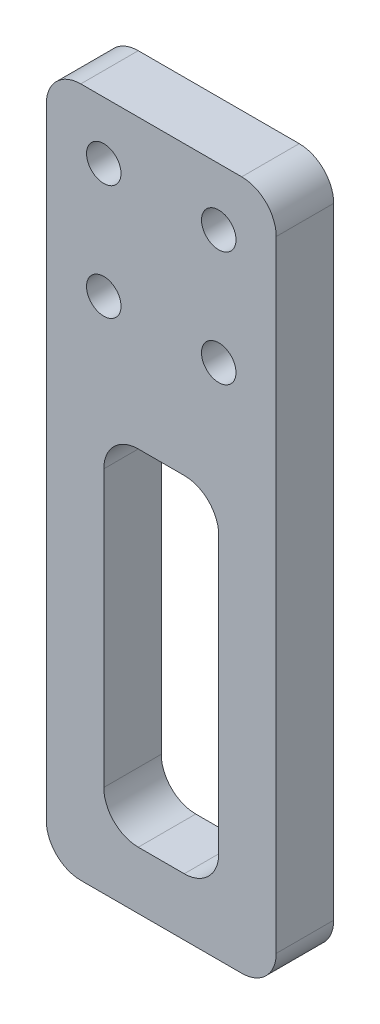
ISO-10303-21;
HEADER;
FILE_DESCRIPTION(('STEP AP214'),'2;1');
FILE_NAME('part.step','',(''),(''),'','','');
FILE_SCHEMA(('AUTOMOTIVE_DESIGN { 1 0 10303 214 1 1 1 1 }'));
ENDSEC;
DATA;
#1=APPLICATION_CONTEXT('core data for automotive mechanical design processes');
#2=APPLICATION_PROTOCOL_DEFINITION('international standard','automotive_design',2000,#1);
#3=PRODUCT_CONTEXT('',#1,'mechanical');
#4=PRODUCT('Part','Part','',(#3));
#5=PRODUCT_RELATED_PRODUCT_CATEGORY('part','',(#4));
#6=PRODUCT_DEFINITION_FORMATION('','',#4);
#7=PRODUCT_DEFINITION_CONTEXT('part definition',#1,'design');
#8=PRODUCT_DEFINITION('design','',#6,#7);
#9=PRODUCT_DEFINITION_SHAPE('','',#8);
#10=(LENGTH_UNIT() NAMED_UNIT(*) SI_UNIT(.MILLI.,.METRE.));
#11=(NAMED_UNIT(*) PLANE_ANGLE_UNIT() SI_UNIT($,.RADIAN.));
#12=(NAMED_UNIT(*) SI_UNIT($,.STERADIAN.) SOLID_ANGLE_UNIT());
#13=UNCERTAINTY_MEASURE_WITH_UNIT(LENGTH_MEASURE(1.E-05),#10,'distance_accuracy_value','');
#14=(GEOMETRIC_REPRESENTATION_CONTEXT(3) GLOBAL_UNCERTAINTY_ASSIGNED_CONTEXT((#13)) GLOBAL_UNIT_ASSIGNED_CONTEXT((#10,
#11,#12)) REPRESENTATION_CONTEXT('',''));
#15=CARTESIAN_POINT('',(0.,0.,0.));
#16=DIRECTION('',(0.,0.,1.));
#17=DIRECTION('',(1.,0.,0.));
#18=AXIS2_PLACEMENT_3D('',#15,#16,#17);
#19=CARTESIAN_POINT('',(10.,-30.,5.));
#20=DIRECTION('',(-1.,0.,0.));
#21=DIRECTION('',(0.,0.,1.));
#22=AXIS2_PLACEMENT_3D('',#19,#20,#21);
#23=PLANE('',#22);
#24=DIRECTION('',(0.,1.,0.));
#25=VECTOR('',#24,1.);
#26=CARTESIAN_POINT('',(10.,-30.,0.));
#27=LINE('',#26,#25);
#28=CARTESIAN_POINT('',(10.,-27.,0.));
#29=VERTEX_POINT('',#28);
#30=CARTESIAN_POINT('',(10.,27.,0.));
#31=VERTEX_POINT('',#30);
#32=EDGE_CURVE('E179',#29,#31,#27,.T.);
#33=ORIENTED_EDGE('',*,*,#32,.T.);
#34=DIRECTION('',(0.,0.,-1.));
#35=VECTOR('',#34,1.);
#36=CARTESIAN_POINT('',(10.,27.,5.));
#37=LINE('',#36,#35);
#38=CARTESIAN_POINT('',(10.,27.,5.));
#39=VERTEX_POINT('',#38);
#40=EDGE_CURVE('E202',#31,#39,#37,.F.);
#41=ORIENTED_EDGE('',*,*,#40,.T.);
#42=DIRECTION('',(0.,1.,0.));
#43=VECTOR('',#42,1.);
#44=CARTESIAN_POINT('',(10.,-30.,5.));
#45=LINE('',#44,#43);
#46=CARTESIAN_POINT('',(10.,-27.,5.));
#47=VERTEX_POINT('',#46);
#48=EDGE_CURVE('E177',#47,#39,#45,.T.);
#49=ORIENTED_EDGE('',*,*,#48,.F.);
#50=DIRECTION('',(0.,0.,-1.));
#51=VECTOR('',#50,1.);
#52=CARTESIAN_POINT('',(10.,-27.,5.));
#53=LINE('',#52,#51);
#54=EDGE_CURVE('E199',#47,#29,#53,.T.);
#55=ORIENTED_EDGE('',*,*,#54,.T.);
#56=EDGE_LOOP('',(#33,#41,#49,#55));
#57=FACE_BOUND('',#56,.T.);
#58=ADVANCED_FACE('F35',(#57),#23,.F.);
#59=CARTESIAN_POINT('',(-10.,30.,5.));
#60=DIRECTION('',(0.,-1.,0.));
#61=DIRECTION('',(0.,0.,-1.));
#62=AXIS2_PLACEMENT_3D('',#59,#60,#61);
#63=PLANE('',#62);
#64=DIRECTION('',(-1.,0.,0.));
#65=VECTOR('',#64,1.);
#66=CARTESIAN_POINT('',(-10.,30.,0.));
#67=LINE('',#66,#65);
#68=CARTESIAN_POINT('',(7.,30.,0.));
#69=VERTEX_POINT('',#68);
#70=CARTESIAN_POINT('',(-7.,30.,0.));
#71=VERTEX_POINT('',#70);
#72=EDGE_CURVE('E175',#69,#71,#67,.T.);
#73=ORIENTED_EDGE('',*,*,#72,.T.);
#74=DIRECTION('',(0.,0.,-1.));
#75=VECTOR('',#74,1.);
#76=CARTESIAN_POINT('',(-7.,30.,5.));
#77=LINE('',#76,#75);
#78=CARTESIAN_POINT('',(-7.,30.,5.));
#79=VERTEX_POINT('',#78);
#80=EDGE_CURVE('E154',#71,#79,#77,.F.);
#81=ORIENTED_EDGE('',*,*,#80,.T.);
#82=DIRECTION('',(-1.,0.,0.));
#83=VECTOR('',#82,1.);
#84=CARTESIAN_POINT('',(-10.,30.,5.));
#85=LINE('',#84,#83);
#86=CARTESIAN_POINT('',(7.,30.,5.));
#87=VERTEX_POINT('',#86);
#88=EDGE_CURVE('E309',#87,#79,#85,.T.);
#89=ORIENTED_EDGE('',*,*,#88,.F.);
#90=DIRECTION('',(0.,0.,-1.));
#91=VECTOR('',#90,1.);
#92=CARTESIAN_POINT('',(7.,30.,5.));
#93=LINE('',#92,#91);
#94=EDGE_CURVE('E159',#87,#69,#93,.T.);
#95=ORIENTED_EDGE('',*,*,#94,.T.);
#96=EDGE_LOOP('',(#73,#81,#89,#95));
#97=FACE_BOUND('',#96,.T.);
#98=ADVANCED_FACE('F325',(#97),#63,.F.);
#99=CARTESIAN_POINT('',(-10.,-30.,5.));
#100=DIRECTION('',(1.,0.,0.));
#101=DIRECTION('',(0.,0.,-1.));
#102=AXIS2_PLACEMENT_3D('',#99,#100,#101);
#103=PLANE('',#102);
#104=DIRECTION('',(0.,-1.,0.));
#105=VECTOR('',#104,1.);
#106=CARTESIAN_POINT('',(-10.,-30.,5.));
#107=LINE('',#106,#105);
#108=CARTESIAN_POINT('',(-10.,27.,5.));
#109=VERTEX_POINT('',#108);
#110=CARTESIAN_POINT('',(-10.,-27.,5.));
#111=VERTEX_POINT('',#110);
#112=EDGE_CURVE('E168',#109,#111,#107,.T.);
#113=ORIENTED_EDGE('',*,*,#112,.F.);
#114=DIRECTION('',(0.,0.,-1.));
#115=VECTOR('',#114,1.);
#116=CARTESIAN_POINT('',(-10.,27.,5.));
#117=LINE('',#116,#115);
#118=CARTESIAN_POINT('',(-10.,27.,0.));
#119=VERTEX_POINT('',#118);
#120=EDGE_CURVE('E153',#109,#119,#117,.T.);
#121=ORIENTED_EDGE('',*,*,#120,.T.);
#122=DIRECTION('',(0.,-1.,0.));
#123=VECTOR('',#122,1.);
#124=CARTESIAN_POINT('',(-10.,-30.,0.));
#125=LINE('',#124,#123);
#126=CARTESIAN_POINT('',(-10.,-27.,0.));
#127=VERTEX_POINT('',#126);
#128=EDGE_CURVE('E166',#119,#127,#125,.T.);
#129=ORIENTED_EDGE('',*,*,#128,.T.);
#130=DIRECTION('',(0.,0.,-1.));
#131=VECTOR('',#130,1.);
#132=CARTESIAN_POINT('',(-10.,-27.,5.));
#133=LINE('',#132,#131);
#134=EDGE_CURVE('E170',#127,#111,#133,.F.);
#135=ORIENTED_EDGE('',*,*,#134,.T.);
#136=EDGE_LOOP('',(#113,#121,#129,#135));
#137=FACE_BOUND('',#136,.T.);
#138=ADVANCED_FACE('F165',(#137),#103,.F.);
#139=CARTESIAN_POINT('',(-10.,-30.,5.));
#140=DIRECTION('',(0.,1.,0.));
#141=DIRECTION('',(0.,0.,1.));
#142=AXIS2_PLACEMENT_3D('',#139,#140,#141);
#143=PLANE('',#142);
#144=DIRECTION('',(1.,0.,0.));
#145=VECTOR('',#144,1.);
#146=CARTESIAN_POINT('',(-10.,-30.,0.));
#147=LINE('',#146,#145);
#148=CARTESIAN_POINT('',(-7.,-30.,0.));
#149=VERTEX_POINT('',#148);
#150=CARTESIAN_POINT('',(7.,-30.,0.));
#151=VERTEX_POINT('',#150);
#152=EDGE_CURVE('E174',#149,#151,#147,.T.);
#153=ORIENTED_EDGE('',*,*,#152,.T.);
#154=DIRECTION('',(0.,0.,-1.));
#155=VECTOR('',#154,1.);
#156=CARTESIAN_POINT('',(7.,-30.,5.));
#157=LINE('',#156,#155);
#158=CARTESIAN_POINT('',(7.,-30.,5.));
#159=VERTEX_POINT('',#158);
#160=EDGE_CURVE('E50',#151,#159,#157,.F.);
#161=ORIENTED_EDGE('',*,*,#160,.T.);
#162=DIRECTION('',(1.,0.,0.));
#163=VECTOR('',#162,1.);
#164=CARTESIAN_POINT('',(-10.,-30.,5.));
#165=LINE('',#164,#163);
#166=CARTESIAN_POINT('',(-7.,-30.,5.));
#167=VERTEX_POINT('',#166);
#168=EDGE_CURVE('E183',#167,#159,#165,.T.);
#169=ORIENTED_EDGE('',*,*,#168,.F.);
#170=DIRECTION('',(0.,0.,-1.));
#171=VECTOR('',#170,1.);
#172=CARTESIAN_POINT('',(-7.,-30.,5.));
#173=LINE('',#172,#171);
#174=EDGE_CURVE('E204',#167,#149,#173,.T.);
#175=ORIENTED_EDGE('',*,*,#174,.T.);
#176=EDGE_LOOP('',(#153,#161,#169,#175));
#177=FACE_BOUND('',#176,.T.);
#178=ADVANCED_FACE('F332',(#177),#143,.F.);
#179=CARTESIAN_POINT('',(0.,0.,5.));
#180=DIRECTION('',(0.,0.,-1.));
#181=DIRECTION('',(-1.,0.,0.));
#182=AXIS2_PLACEMENT_3D('',#179,#180,#181);
#183=PLANE('',#182);
#184=DIRECTION('',(-1.,0.,0.));
#185=VECTOR('',#184,1.);
#186=CARTESIAN_POINT('',(-5.,5.,5.));
#187=LINE('',#186,#185);
#188=CARTESIAN_POINT('',(2.,5.,5.));
#189=VERTEX_POINT('',#188);
#190=CARTESIAN_POINT('',(-2.,5.,5.));
#191=VERTEX_POINT('',#190);
#192=EDGE_CURVE('E245',#189,#191,#187,.T.);
#193=ORIENTED_EDGE('',*,*,#192,.F.);
#194=CARTESIAN_POINT('',(2.,2.,5.));
#195=DIRECTION('',(0.,0.,-1.));
#196=DIRECTION('',(-1.,0.,0.));
#197=AXIS2_PLACEMENT_3D('',#194,#195,#196);
#198=CIRCLE('',#197,3.);
#199=CARTESIAN_POINT('',(5.,2.,5.));
#200=VERTEX_POINT('',#199);
#201=EDGE_CURVE('E236',#189,#200,#198,.T.);
#202=ORIENTED_EDGE('',*,*,#201,.T.);
#203=DIRECTION('',(0.,1.,0.));
#204=VECTOR('',#203,1.);
#205=CARTESIAN_POINT('',(5.,-25.,5.));
#206=LINE('',#205,#204);
#207=CARTESIAN_POINT('',(5.,-22.,5.));
#208=VERTEX_POINT('',#207);
#209=EDGE_CURVE('E256',#208,#200,#206,.T.);
#210=ORIENTED_EDGE('',*,*,#209,.F.);
#211=CARTESIAN_POINT('',(2.,-22.,5.));
#212=DIRECTION('',(0.,0.,-1.));
#213=DIRECTION('',(-1.,0.,0.));
#214=AXIS2_PLACEMENT_3D('',#211,#212,#213);
#215=CIRCLE('',#214,3.);
#216=CARTESIAN_POINT('',(2.,-25.,5.));
#217=VERTEX_POINT('',#216);
#218=EDGE_CURVE('E228',#208,#217,#215,.T.);
#219=ORIENTED_EDGE('',*,*,#218,.T.);
#220=DIRECTION('',(1.,0.,0.));
#221=VECTOR('',#220,1.);
#222=CARTESIAN_POINT('',(-5.,-25.,5.));
#223=LINE('',#222,#221);
#224=CARTESIAN_POINT('',(-2.,-25.,5.));
#225=VERTEX_POINT('',#224);
#226=EDGE_CURVE('E281',#225,#217,#223,.T.);
#227=ORIENTED_EDGE('',*,*,#226,.F.);
#228=CARTESIAN_POINT('',(-2.,-22.,5.));
#229=DIRECTION('',(0.,0.,-1.));
#230=DIRECTION('',(-1.,0.,0.));
#231=AXIS2_PLACEMENT_3D('',#228,#229,#230);
#232=CIRCLE('',#231,3.);
#233=CARTESIAN_POINT('',(-5.,-22.,5.));
#234=VERTEX_POINT('',#233);
#235=EDGE_CURVE('E232',#225,#234,#232,.T.);
#236=ORIENTED_EDGE('',*,*,#235,.T.);
#237=DIRECTION('',(0.,-1.,0.));
#238=VECTOR('',#237,1.);
#239=CARTESIAN_POINT('',(-5.,-25.,5.));
#240=LINE('',#239,#238);
#241=CARTESIAN_POINT('',(-5.,2.,5.));
#242=VERTEX_POINT('',#241);
#243=EDGE_CURVE('E247',#242,#234,#240,.T.);
#244=ORIENTED_EDGE('',*,*,#243,.F.);
#245=CARTESIAN_POINT('',(-2.,2.,5.));
#246=DIRECTION('',(0.,0.,-1.));
#247=DIRECTION('',(-1.,0.,0.));
#248=AXIS2_PLACEMENT_3D('',#245,#246,#247);
#249=CIRCLE('',#248,3.);
#250=EDGE_CURVE('E43',#242,#191,#249,.T.);
#251=ORIENTED_EDGE('',*,*,#250,.T.);
#252=EDGE_LOOP('',(#193,#202,#210,#219,#227,#236,#244,#251));
#253=FACE_BOUND('',#252,.T.);
#254=CARTESIAN_POINT('',(5.,25.,5.));
#255=DIRECTION('',(0.,0.,1.));
#256=DIRECTION('',(-1.,0.,0.));
#257=AXIS2_PLACEMENT_3D('',#254,#255,#256);
#258=CIRCLE('',#257,1.5);
#259=CARTESIAN_POINT('',(3.5,25.,5.));
#260=VERTEX_POINT('',#259);
#261=EDGE_CURVE('E272',#260,#260,#258,.T.);
#262=ORIENTED_EDGE('',*,*,#261,.F.);
#263=EDGE_LOOP('',(#262));
#264=FACE_BOUND('',#263,.T.);
#265=CARTESIAN_POINT('',(5.,15.,5.));
#266=DIRECTION('',(0.,0.,1.));
#267=DIRECTION('',(-1.,0.,0.));
#268=AXIS2_PLACEMENT_3D('',#265,#266,#267);
#269=CIRCLE('',#268,1.5);
#270=CARTESIAN_POINT('',(3.5,15.,5.));
#271=VERTEX_POINT('',#270);
#272=EDGE_CURVE('E294',#271,#271,#269,.T.);
#273=ORIENTED_EDGE('',*,*,#272,.F.);
#274=EDGE_LOOP('',(#273));
#275=FACE_BOUND('',#274,.T.);
#276=CARTESIAN_POINT('',(-5.,15.,5.));
#277=DIRECTION('',(0.,0.,1.));
#278=DIRECTION('',(1.,0.,0.));
#279=AXIS2_PLACEMENT_3D('',#276,#277,#278);
#280=CIRCLE('',#279,1.5);
#281=CARTESIAN_POINT('',(-3.5,15.,5.));
#282=VERTEX_POINT('',#281);
#283=EDGE_CURVE('E288',#282,#282,#280,.T.);
#284=ORIENTED_EDGE('',*,*,#283,.F.);
#285=EDGE_LOOP('',(#284));
#286=FACE_BOUND('',#285,.T.);
#287=CARTESIAN_POINT('',(-5.,25.,5.));
#288=DIRECTION('',(0.,0.,1.));
#289=DIRECTION('',(1.,0.,0.));
#290=AXIS2_PLACEMENT_3D('',#287,#288,#289);
#291=CIRCLE('',#290,1.5);
#292=CARTESIAN_POINT('',(-3.5,25.,5.));
#293=VERTEX_POINT('',#292);
#294=EDGE_CURVE('E287',#293,#293,#291,.T.);
#295=ORIENTED_EDGE('',*,*,#294,.F.);
#296=EDGE_LOOP('',(#295));
#297=FACE_BOUND('',#296,.T.);
#298=ORIENTED_EDGE('',*,*,#88,.T.);
#299=CARTESIAN_POINT('',(-7.,27.,5.));
#300=DIRECTION('',(0.,0.,-1.));
#301=DIRECTION('',(-1.,0.,0.));
#302=AXIS2_PLACEMENT_3D('',#299,#300,#301);
#303=CIRCLE('',#302,3.);
#304=EDGE_CURVE('E197',#79,#109,#303,.F.);
#305=ORIENTED_EDGE('',*,*,#304,.T.);
#306=ORIENTED_EDGE('',*,*,#112,.T.);
#307=CARTESIAN_POINT('',(-7.,-27.,5.));
#308=DIRECTION('',(0.,0.,-1.));
#309=DIRECTION('',(-1.,0.,0.));
#310=AXIS2_PLACEMENT_3D('',#307,#308,#309);
#311=CIRCLE('',#310,3.);
#312=EDGE_CURVE('E57',#111,#167,#311,.F.);
#313=ORIENTED_EDGE('',*,*,#312,.T.);
#314=ORIENTED_EDGE('',*,*,#168,.T.);
#315=CARTESIAN_POINT('',(7.,-27.,5.));
#316=DIRECTION('',(0.,0.,-1.));
#317=DIRECTION('',(-1.,0.,0.));
#318=AXIS2_PLACEMENT_3D('',#315,#316,#317);
#319=CIRCLE('',#318,3.);
#320=EDGE_CURVE('E193',#159,#47,#319,.F.);
#321=ORIENTED_EDGE('',*,*,#320,.T.);
#322=ORIENTED_EDGE('',*,*,#48,.T.);
#323=CARTESIAN_POINT('',(7.,27.,5.));
#324=DIRECTION('',(0.,0.,-1.));
#325=DIRECTION('',(-1.,0.,0.));
#326=AXIS2_PLACEMENT_3D('',#323,#324,#325);
#327=CIRCLE('',#326,3.);
#328=EDGE_CURVE('E195',#39,#87,#327,.F.);
#329=ORIENTED_EDGE('',*,*,#328,.T.);
#330=EDGE_LOOP('',(#298,#305,#306,#313,#314,#321,#322,#329));
#331=FACE_BOUND('',#330,.T.);
#332=ADVANCED_FACE('F243',(#253,#264,#275,#286,#297,#331),#183,.F.);
#333=CARTESIAN_POINT('',(0.,0.,0.));
#334=DIRECTION('',(0.,0.,-1.));
#335=DIRECTION('',(-1.,0.,0.));
#336=AXIS2_PLACEMENT_3D('',#333,#334,#335);
#337=PLANE('',#336);
#338=DIRECTION('',(1.,0.,0.));
#339=VECTOR('',#338,1.);
#340=CARTESIAN_POINT('',(-5.,-25.,0.));
#341=LINE('',#340,#339);
#342=CARTESIAN_POINT('',(-2.,-25.,0.));
#343=VERTEX_POINT('',#342);
#344=CARTESIAN_POINT('',(2.,-25.,0.));
#345=VERTEX_POINT('',#344);
#346=EDGE_CURVE('E270',#343,#345,#341,.T.);
#347=ORIENTED_EDGE('',*,*,#346,.T.);
#348=CARTESIAN_POINT('',(2.,-22.,0.));
#349=DIRECTION('',(0.,0.,-1.));
#350=DIRECTION('',(-1.,0.,0.));
#351=AXIS2_PLACEMENT_3D('',#348,#349,#350);
#352=CIRCLE('',#351,3.);
#353=CARTESIAN_POINT('',(5.,-22.,0.));
#354=VERTEX_POINT('',#353);
#355=EDGE_CURVE('E230',#345,#354,#352,.F.);
#356=ORIENTED_EDGE('',*,*,#355,.T.);
#357=DIRECTION('',(0.,1.,0.));
#358=VECTOR('',#357,1.);
#359=CARTESIAN_POINT('',(5.,-25.,0.));
#360=LINE('',#359,#358);
#361=CARTESIAN_POINT('',(5.,2.,0.));
#362=VERTEX_POINT('',#361);
#363=EDGE_CURVE('E274',#354,#362,#360,.T.);
#364=ORIENTED_EDGE('',*,*,#363,.T.);
#365=CARTESIAN_POINT('',(2.,2.,0.));
#366=DIRECTION('',(0.,0.,-1.));
#367=DIRECTION('',(-1.,0.,0.));
#368=AXIS2_PLACEMENT_3D('',#365,#366,#367);
#369=CIRCLE('',#368,3.);
#370=CARTESIAN_POINT('',(2.,5.,0.));
#371=VERTEX_POINT('',#370);
#372=EDGE_CURVE('E238',#362,#371,#369,.F.);
#373=ORIENTED_EDGE('',*,*,#372,.T.);
#374=DIRECTION('',(-1.,0.,0.));
#375=VECTOR('',#374,1.);
#376=CARTESIAN_POINT('',(-5.,5.,0.));
#377=LINE('',#376,#375);
#378=CARTESIAN_POINT('',(-2.,5.,0.));
#379=VERTEX_POINT('',#378);
#380=EDGE_CURVE('E266',#371,#379,#377,.T.);
#381=ORIENTED_EDGE('',*,*,#380,.T.);
#382=CARTESIAN_POINT('',(-2.,2.,0.));
#383=DIRECTION('',(0.,0.,-1.));
#384=DIRECTION('',(-1.,0.,0.));
#385=AXIS2_PLACEMENT_3D('',#382,#383,#384);
#386=CIRCLE('',#385,3.);
#387=CARTESIAN_POINT('',(-5.,2.,0.));
#388=VERTEX_POINT('',#387);
#389=EDGE_CURVE('E11',#379,#388,#386,.F.);
#390=ORIENTED_EDGE('',*,*,#389,.T.);
#391=DIRECTION('',(0.,-1.,0.));
#392=VECTOR('',#391,1.);
#393=CARTESIAN_POINT('',(-5.,-25.,0.));
#394=LINE('',#393,#392);
#395=CARTESIAN_POINT('',(-5.,-22.,0.));
#396=VERTEX_POINT('',#395);
#397=EDGE_CURVE('E264',#388,#396,#394,.T.);
#398=ORIENTED_EDGE('',*,*,#397,.T.);
#399=CARTESIAN_POINT('',(-2.,-22.,0.));
#400=DIRECTION('',(0.,0.,-1.));
#401=DIRECTION('',(-1.,0.,0.));
#402=AXIS2_PLACEMENT_3D('',#399,#400,#401);
#403=CIRCLE('',#402,3.);
#404=EDGE_CURVE('E234',#396,#343,#403,.F.);
#405=ORIENTED_EDGE('',*,*,#404,.T.);
#406=EDGE_LOOP('',(#347,#356,#364,#373,#381,#390,#398,#405));
#407=FACE_BOUND('',#406,.T.);
#408=CARTESIAN_POINT('',(5.,25.,0.));
#409=DIRECTION('',(0.,0.,1.));
#410=DIRECTION('',(-1.,0.,0.));
#411=AXIS2_PLACEMENT_3D('',#408,#409,#410);
#412=CIRCLE('',#411,1.5);
#413=CARTESIAN_POINT('',(3.5,25.,0.));
#414=VERTEX_POINT('',#413);
#415=EDGE_CURVE('E297',#414,#414,#412,.T.);
#416=ORIENTED_EDGE('',*,*,#415,.T.);
#417=EDGE_LOOP('',(#416));
#418=FACE_BOUND('',#417,.T.);
#419=CARTESIAN_POINT('',(5.,15.,0.));
#420=DIRECTION('',(0.,0.,1.));
#421=DIRECTION('',(-1.,0.,0.));
#422=AXIS2_PLACEMENT_3D('',#419,#420,#421);
#423=CIRCLE('',#422,1.5);
#424=CARTESIAN_POINT('',(3.5,15.,0.));
#425=VERTEX_POINT('',#424);
#426=EDGE_CURVE('E291',#425,#425,#423,.T.);
#427=ORIENTED_EDGE('',*,*,#426,.T.);
#428=EDGE_LOOP('',(#427));
#429=FACE_BOUND('',#428,.T.);
#430=CARTESIAN_POINT('',(-5.,15.,0.));
#431=DIRECTION('',(0.,0.,1.));
#432=DIRECTION('',(1.,0.,0.));
#433=AXIS2_PLACEMENT_3D('',#430,#431,#432);
#434=CIRCLE('',#433,1.5);
#435=CARTESIAN_POINT('',(-3.5,15.,0.));
#436=VERTEX_POINT('',#435);
#437=EDGE_CURVE('E284',#436,#436,#434,.T.);
#438=ORIENTED_EDGE('',*,*,#437,.T.);
#439=EDGE_LOOP('',(#438));
#440=FACE_BOUND('',#439,.T.);
#441=CARTESIAN_POINT('',(-5.,25.,0.));
#442=DIRECTION('',(0.,0.,1.));
#443=DIRECTION('',(1.,0.,0.));
#444=AXIS2_PLACEMENT_3D('',#441,#442,#443);
#445=CIRCLE('',#444,1.5);
#446=CARTESIAN_POINT('',(-3.5,25.,0.));
#447=VERTEX_POINT('',#446);
#448=EDGE_CURVE('E302',#447,#447,#445,.T.);
#449=ORIENTED_EDGE('',*,*,#448,.T.);
#450=EDGE_LOOP('',(#449));
#451=FACE_BOUND('',#450,.T.);
#452=ORIENTED_EDGE('',*,*,#128,.F.);
#453=CARTESIAN_POINT('',(-7.,27.,0.));
#454=DIRECTION('',(0.,0.,-1.));
#455=DIRECTION('',(-1.,0.,0.));
#456=AXIS2_PLACEMENT_3D('',#453,#454,#455);
#457=CIRCLE('',#456,3.);
#458=EDGE_CURVE('E149',#119,#71,#457,.T.);
#459=ORIENTED_EDGE('',*,*,#458,.T.);
#460=ORIENTED_EDGE('',*,*,#72,.F.);
#461=CARTESIAN_POINT('',(7.,27.,0.));
#462=DIRECTION('',(0.,0.,-1.));
#463=DIRECTION('',(-1.,0.,0.));
#464=AXIS2_PLACEMENT_3D('',#461,#462,#463);
#465=CIRCLE('',#464,3.);
#466=EDGE_CURVE('E160',#69,#31,#465,.T.);
#467=ORIENTED_EDGE('',*,*,#466,.T.);
#468=ORIENTED_EDGE('',*,*,#32,.F.);
#469=CARTESIAN_POINT('',(7.,-27.,0.));
#470=DIRECTION('',(0.,0.,-1.));
#471=DIRECTION('',(-1.,0.,0.));
#472=AXIS2_PLACEMENT_3D('',#469,#470,#471);
#473=CIRCLE('',#472,3.);
#474=EDGE_CURVE('E186',#29,#151,#473,.T.);
#475=ORIENTED_EDGE('',*,*,#474,.T.);
#476=ORIENTED_EDGE('',*,*,#152,.F.);
#477=CARTESIAN_POINT('',(-7.,-27.,0.));
#478=DIRECTION('',(0.,0.,-1.));
#479=DIRECTION('',(-1.,0.,0.));
#480=AXIS2_PLACEMENT_3D('',#477,#478,#479);
#481=CIRCLE('',#480,3.);
#482=EDGE_CURVE('E169',#149,#127,#481,.T.);
#483=ORIENTED_EDGE('',*,*,#482,.T.);
#484=EDGE_LOOP('',(#452,#459,#460,#467,#468,#475,#476,#483));
#485=FACE_BOUND('',#484,.T.);
#486=ADVANCED_FACE('F172',(#407,#418,#429,#440,#451,#485),#337,.T.);
#487=CARTESIAN_POINT('',(-5.,25.,0.));
#488=DIRECTION('',(0.,0.,1.));
#489=DIRECTION('',(1.,0.,0.));
#490=AXIS2_PLACEMENT_3D('',#487,#488,#489);
#491=CYLINDRICAL_SURFACE('',#490,1.5);
#492=ORIENTED_EDGE('',*,*,#448,.F.);
#493=EDGE_LOOP('',(#492));
#494=FACE_BOUND('',#493,.T.);
#495=ORIENTED_EDGE('',*,*,#294,.T.);
#496=EDGE_LOOP('',(#495));
#497=FACE_BOUND('',#496,.T.);
#498=ADVANCED_FACE('F393',(#494,#497),#491,.F.);
#499=CARTESIAN_POINT('',(-5.,15.,0.));
#500=DIRECTION('',(0.,0.,1.));
#501=DIRECTION('',(1.,0.,0.));
#502=AXIS2_PLACEMENT_3D('',#499,#500,#501);
#503=CYLINDRICAL_SURFACE('',#502,1.5);
#504=ORIENTED_EDGE('',*,*,#437,.F.);
#505=EDGE_LOOP('',(#504));
#506=FACE_BOUND('',#505,.T.);
#507=ORIENTED_EDGE('',*,*,#283,.T.);
#508=EDGE_LOOP('',(#507));
#509=FACE_BOUND('',#508,.T.);
#510=ADVANCED_FACE('F389',(#506,#509),#503,.F.);
#511=CARTESIAN_POINT('',(5.,15.,0.));
#512=DIRECTION('',(0.,0.,1.));
#513=DIRECTION('',(1.,0.,0.));
#514=AXIS2_PLACEMENT_3D('',#511,#512,#513);
#515=CYLINDRICAL_SURFACE('',#514,1.5);
#516=ORIENTED_EDGE('',*,*,#426,.F.);
#517=EDGE_LOOP('',(#516));
#518=FACE_BOUND('',#517,.T.);
#519=ORIENTED_EDGE('',*,*,#272,.T.);
#520=EDGE_LOOP('',(#519));
#521=FACE_BOUND('',#520,.T.);
#522=ADVANCED_FACE('F392',(#518,#521),#515,.F.);
#523=CARTESIAN_POINT('',(5.,25.,0.));
#524=DIRECTION('',(0.,0.,1.));
#525=DIRECTION('',(1.,0.,0.));
#526=AXIS2_PLACEMENT_3D('',#523,#524,#525);
#527=CYLINDRICAL_SURFACE('',#526,1.5);
#528=ORIENTED_EDGE('',*,*,#415,.F.);
#529=EDGE_LOOP('',(#528));
#530=FACE_BOUND('',#529,.T.);
#531=ORIENTED_EDGE('',*,*,#261,.T.);
#532=EDGE_LOOP('',(#531));
#533=FACE_BOUND('',#532,.T.);
#534=ADVANCED_FACE('F384',(#530,#533),#527,.F.);
#535=CARTESIAN_POINT('',(5.,-25.,0.));
#536=DIRECTION('',(1.,0.,0.));
#537=DIRECTION('',(0.,0.,-1.));
#538=AXIS2_PLACEMENT_3D('',#535,#536,#537);
#539=PLANE('',#538);
#540=ORIENTED_EDGE('',*,*,#363,.F.);
#541=DIRECTION('',(0.,0.,1.));
#542=VECTOR('',#541,1.);
#543=CARTESIAN_POINT('',(5.,-22.,5.));
#544=LINE('',#543,#542);
#545=EDGE_CURVE('E210',#354,#208,#544,.T.);
#546=ORIENTED_EDGE('',*,*,#545,.T.);
#547=ORIENTED_EDGE('',*,*,#209,.T.);
#548=DIRECTION('',(0.,0.,1.));
#549=VECTOR('',#548,1.);
#550=CARTESIAN_POINT('',(5.,2.,0.));
#551=LINE('',#550,#549);
#552=EDGE_CURVE('E208',#200,#362,#551,.F.);
#553=ORIENTED_EDGE('',*,*,#552,.T.);
#554=EDGE_LOOP('',(#540,#546,#547,#553));
#555=FACE_BOUND('',#554,.T.);
#556=ADVANCED_FACE('F369',(#555),#539,.F.);
#557=CARTESIAN_POINT('',(-5.,-25.,0.));
#558=DIRECTION('',(0.,-1.,0.));
#559=DIRECTION('',(0.,0.,-1.));
#560=AXIS2_PLACEMENT_3D('',#557,#558,#559);
#561=PLANE('',#560);
#562=ORIENTED_EDGE('',*,*,#226,.T.);
#563=DIRECTION('',(0.,0.,1.));
#564=VECTOR('',#563,1.);
#565=CARTESIAN_POINT('',(2.,-25.,0.));
#566=LINE('',#565,#564);
#567=EDGE_CURVE('E216',#217,#345,#566,.F.);
#568=ORIENTED_EDGE('',*,*,#567,.T.);
#569=ORIENTED_EDGE('',*,*,#346,.F.);
#570=DIRECTION('',(0.,0.,1.));
#571=VECTOR('',#570,1.);
#572=CARTESIAN_POINT('',(-2.,-25.,5.));
#573=LINE('',#572,#571);
#574=EDGE_CURVE('E213',#343,#225,#573,.T.);
#575=ORIENTED_EDGE('',*,*,#574,.T.);
#576=EDGE_LOOP('',(#562,#568,#569,#575));
#577=FACE_BOUND('',#576,.T.);
#578=ADVANCED_FACE('F374',(#577),#561,.F.);
#579=CARTESIAN_POINT('',(-5.,-25.,0.));
#580=DIRECTION('',(-1.,0.,0.));
#581=DIRECTION('',(0.,0.,1.));
#582=AXIS2_PLACEMENT_3D('',#579,#580,#581);
#583=PLANE('',#582);
#584=ORIENTED_EDGE('',*,*,#243,.T.);
#585=DIRECTION('',(0.,0.,1.));
#586=VECTOR('',#585,1.);
#587=CARTESIAN_POINT('',(-5.,-22.,0.));
#588=LINE('',#587,#586);
#589=EDGE_CURVE('E221',#234,#396,#588,.F.);
#590=ORIENTED_EDGE('',*,*,#589,.T.);
#591=ORIENTED_EDGE('',*,*,#397,.F.);
#592=DIRECTION('',(0.,0.,1.));
#593=VECTOR('',#592,1.);
#594=CARTESIAN_POINT('',(-5.,2.,5.));
#595=LINE('',#594,#593);
#596=EDGE_CURVE('E218',#388,#242,#595,.T.);
#597=ORIENTED_EDGE('',*,*,#596,.T.);
#598=EDGE_LOOP('',(#584,#590,#591,#597));
#599=FACE_BOUND('',#598,.T.);
#600=ADVANCED_FACE('F268',(#599),#583,.F.);
#601=CARTESIAN_POINT('',(-5.,5.,0.));
#602=DIRECTION('',(0.,1.,0.));
#603=DIRECTION('',(0.,0.,1.));
#604=AXIS2_PLACEMENT_3D('',#601,#602,#603);
#605=PLANE('',#604);
#606=ORIENTED_EDGE('',*,*,#380,.F.);
#607=DIRECTION('',(0.,0.,1.));
#608=VECTOR('',#607,1.);
#609=CARTESIAN_POINT('',(2.,5.,5.));
#610=LINE('',#609,#608);
#611=EDGE_CURVE('E225',#371,#189,#610,.T.);
#612=ORIENTED_EDGE('',*,*,#611,.T.);
#613=ORIENTED_EDGE('',*,*,#192,.T.);
#614=DIRECTION('',(0.,0.,1.));
#615=VECTOR('',#614,1.);
#616=CARTESIAN_POINT('',(-2.,5.,0.));
#617=LINE('',#616,#615);
#618=EDGE_CURVE('E223',#191,#379,#617,.F.);
#619=ORIENTED_EDGE('',*,*,#618,.T.);
#620=EDGE_LOOP('',(#606,#612,#613,#619));
#621=FACE_BOUND('',#620,.T.);
#622=ADVANCED_FACE('F253',(#621),#605,.F.);
#623=CARTESIAN_POINT('',(-7.,27.,5.));
#624=DIRECTION('',(0.,0.,-1.));
#625=DIRECTION('',(-1.,0.,0.));
#626=AXIS2_PLACEMENT_3D('',#623,#624,#625);
#627=CYLINDRICAL_SURFACE('',#626,3.);
#628=ORIENTED_EDGE('',*,*,#304,.F.);
#629=ORIENTED_EDGE('',*,*,#80,.F.);
#630=ORIENTED_EDGE('',*,*,#458,.F.);
#631=ORIENTED_EDGE('',*,*,#120,.F.);
#632=EDGE_LOOP('',(#628,#629,#630,#631));
#633=FACE_BOUND('',#632,.T.);
#634=ADVANCED_FACE('F152',(#633),#627,.T.);
#635=CARTESIAN_POINT('',(7.,27.,5.));
#636=DIRECTION('',(0.,0.,-1.));
#637=DIRECTION('',(-1.,0.,0.));
#638=AXIS2_PLACEMENT_3D('',#635,#636,#637);
#639=CYLINDRICAL_SURFACE('',#638,3.);
#640=ORIENTED_EDGE('',*,*,#328,.F.);
#641=ORIENTED_EDGE('',*,*,#40,.F.);
#642=ORIENTED_EDGE('',*,*,#466,.F.);
#643=ORIENTED_EDGE('',*,*,#94,.F.);
#644=EDGE_LOOP('',(#640,#641,#642,#643));
#645=FACE_BOUND('',#644,.T.);
#646=ADVANCED_FACE('F321',(#645),#639,.T.);
#647=CARTESIAN_POINT('',(7.,-27.,5.));
#648=DIRECTION('',(0.,0.,-1.));
#649=DIRECTION('',(-1.,0.,0.));
#650=AXIS2_PLACEMENT_3D('',#647,#648,#649);
#651=CYLINDRICAL_SURFACE('',#650,3.);
#652=ORIENTED_EDGE('',*,*,#320,.F.);
#653=ORIENTED_EDGE('',*,*,#160,.F.);
#654=ORIENTED_EDGE('',*,*,#474,.F.);
#655=ORIENTED_EDGE('',*,*,#54,.F.);
#656=EDGE_LOOP('',(#652,#653,#654,#655));
#657=FACE_BOUND('',#656,.T.);
#658=ADVANCED_FACE('F341',(#657),#651,.T.);
#659=CARTESIAN_POINT('',(-7.,-27.,5.));
#660=DIRECTION('',(0.,0.,-1.));
#661=DIRECTION('',(-1.,0.,0.));
#662=AXIS2_PLACEMENT_3D('',#659,#660,#661);
#663=CYLINDRICAL_SURFACE('',#662,3.);
#664=ORIENTED_EDGE('',*,*,#312,.F.);
#665=ORIENTED_EDGE('',*,*,#134,.F.);
#666=ORIENTED_EDGE('',*,*,#482,.F.);
#667=ORIENTED_EDGE('',*,*,#174,.F.);
#668=EDGE_LOOP('',(#664,#665,#666,#667));
#669=FACE_BOUND('',#668,.T.);
#670=ADVANCED_FACE('F344',(#669),#663,.T.);
#671=CARTESIAN_POINT('',(2.,-22.,0.));
#672=DIRECTION('',(0.,0.,-1.));
#673=DIRECTION('',(-1.,0.,0.));
#674=AXIS2_PLACEMENT_3D('',#671,#672,#673);
#675=CYLINDRICAL_SURFACE('',#674,3.);
#676=ORIENTED_EDGE('',*,*,#355,.F.);
#677=ORIENTED_EDGE('',*,*,#567,.F.);
#678=ORIENTED_EDGE('',*,*,#218,.F.);
#679=ORIENTED_EDGE('',*,*,#545,.F.);
#680=EDGE_LOOP('',(#676,#677,#678,#679));
#681=FACE_BOUND('',#680,.T.);
#682=ADVANCED_FACE('F348',(#681),#675,.F.);
#683=CARTESIAN_POINT('',(-2.,-22.,0.));
#684=DIRECTION('',(0.,0.,-1.));
#685=DIRECTION('',(-1.,0.,0.));
#686=AXIS2_PLACEMENT_3D('',#683,#684,#685);
#687=CYLINDRICAL_SURFACE('',#686,3.);
#688=ORIENTED_EDGE('',*,*,#404,.F.);
#689=ORIENTED_EDGE('',*,*,#589,.F.);
#690=ORIENTED_EDGE('',*,*,#235,.F.);
#691=ORIENTED_EDGE('',*,*,#574,.F.);
#692=EDGE_LOOP('',(#688,#689,#690,#691));
#693=FACE_BOUND('',#692,.T.);
#694=ADVANCED_FACE('F352',(#693),#687,.F.);
#695=CARTESIAN_POINT('',(2.,2.,0.));
#696=DIRECTION('',(0.,0.,-1.));
#697=DIRECTION('',(-1.,0.,0.));
#698=AXIS2_PLACEMENT_3D('',#695,#696,#697);
#699=CYLINDRICAL_SURFACE('',#698,3.);
#700=ORIENTED_EDGE('',*,*,#372,.F.);
#701=ORIENTED_EDGE('',*,*,#552,.F.);
#702=ORIENTED_EDGE('',*,*,#201,.F.);
#703=ORIENTED_EDGE('',*,*,#611,.F.);
#704=EDGE_LOOP('',(#700,#701,#702,#703));
#705=FACE_BOUND('',#704,.T.);
#706=ADVANCED_FACE('F355',(#705),#699,.F.);
#707=CARTESIAN_POINT('',(-2.,2.,0.));
#708=DIRECTION('',(0.,0.,-1.));
#709=DIRECTION('',(-1.,0.,0.));
#710=AXIS2_PLACEMENT_3D('',#707,#708,#709);
#711=CYLINDRICAL_SURFACE('',#710,3.);
#712=ORIENTED_EDGE('',*,*,#389,.F.);
#713=ORIENTED_EDGE('',*,*,#618,.F.);
#714=ORIENTED_EDGE('',*,*,#250,.F.);
#715=ORIENTED_EDGE('',*,*,#596,.F.);
#716=EDGE_LOOP('',(#712,#713,#714,#715));
#717=FACE_BOUND('',#716,.T.);
#718=ADVANCED_FACE('F37',(#717),#711,.F.);
#719=CLOSED_SHELL('',(#58,#98,#138,#178,#332,#486,#498,#510,#522,#534,#556,#578,#600,#622,#634,
#646,#658,#670,#682,#694,#706,#718));
#720=MANIFOLD_SOLID_BREP('B2',#719);
#721=ADVANCED_BREP_SHAPE_REPRESENTATION('',(#18,#720),#14);
#722=SHAPE_DEFINITION_REPRESENTATION(#9,#721);
ENDSEC;
END-ISO-10303-21;
